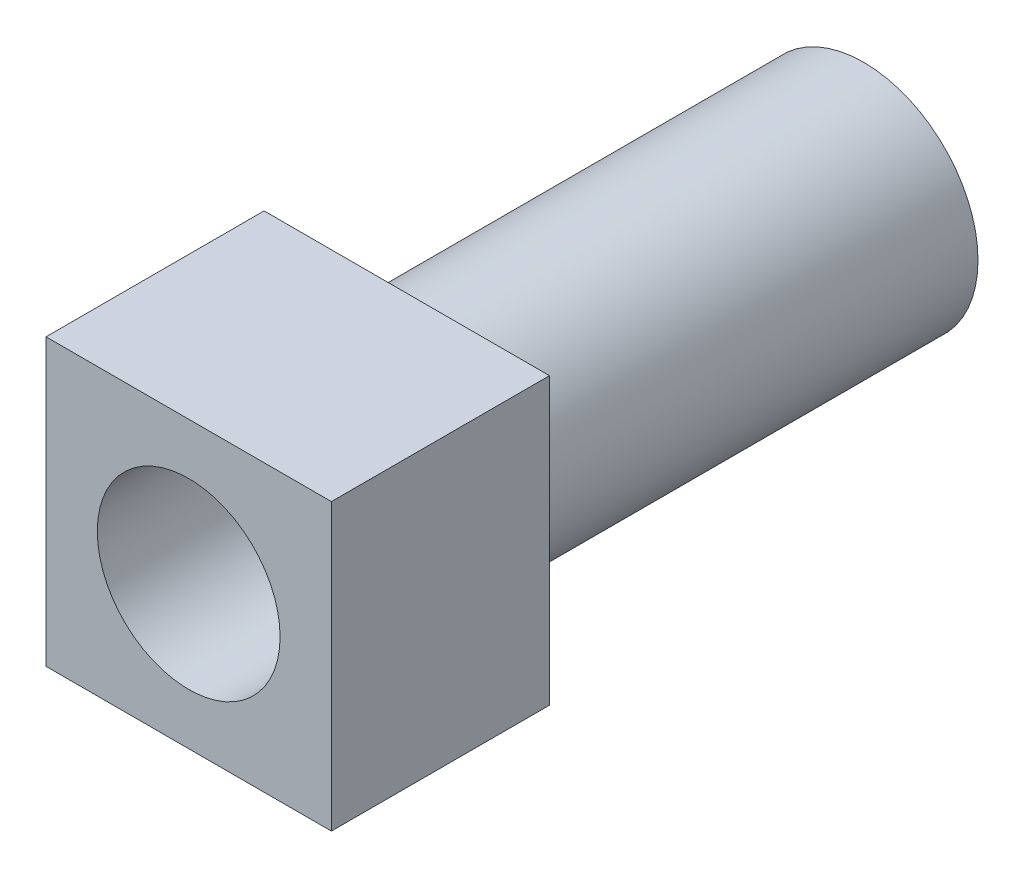
ISO-10303-21;
HEADER;
FILE_DESCRIPTION(('STEP AP214'),'2;1');
FILE_NAME('part.step','',(''),(''),'','','');
FILE_SCHEMA(('AUTOMOTIVE_DESIGN { 1 0 10303 214 1 1 1 1 }'));
ENDSEC;
DATA;
#1=APPLICATION_CONTEXT('core data for automotive mechanical design processes');
#2=APPLICATION_PROTOCOL_DEFINITION('international standard','automotive_design',2000,#1);
#3=PRODUCT_CONTEXT('',#1,'mechanical');
#4=PRODUCT('Part','Part','',(#3));
#5=PRODUCT_RELATED_PRODUCT_CATEGORY('part','',(#4));
#6=PRODUCT_DEFINITION_FORMATION('','',#4);
#7=PRODUCT_DEFINITION_CONTEXT('part definition',#1,'design');
#8=PRODUCT_DEFINITION('design','',#6,#7);
#9=PRODUCT_DEFINITION_SHAPE('','',#8);
#10=(LENGTH_UNIT() NAMED_UNIT(*) SI_UNIT(.MILLI.,.METRE.));
#11=(NAMED_UNIT(*) PLANE_ANGLE_UNIT() SI_UNIT($,.RADIAN.));
#12=(NAMED_UNIT(*) SI_UNIT($,.STERADIAN.) SOLID_ANGLE_UNIT());
#13=UNCERTAINTY_MEASURE_WITH_UNIT(LENGTH_MEASURE(1.E-05),#10,'distance_accuracy_value','');
#14=(GEOMETRIC_REPRESENTATION_CONTEXT(3) GLOBAL_UNCERTAINTY_ASSIGNED_CONTEXT((#13)) GLOBAL_UNIT_ASSIGNED_CONTEXT((#10,
#11,#12)) REPRESENTATION_CONTEXT('',''));
#15=CARTESIAN_POINT('',(0.,0.,0.));
#16=DIRECTION('',(0.,0.,1.));
#17=DIRECTION('',(1.,0.,0.));
#18=AXIS2_PLACEMENT_3D('',#15,#16,#17);
#19=CARTESIAN_POINT('',(-37.0560711306256,15.4804,10.5));
#20=DIRECTION('',(1.,0.,0.));
#21=DIRECTION('',(0.,0.,-1.));
#22=AXIS2_PLACEMENT_3D('',#19,#20,#21);
#23=PLANE('',#22);
#24=DIRECTION('',(0.,-1.,0.));
#25=VECTOR('',#24,1.);
#26=CARTESIAN_POINT('',(-37.0560711306256,15.4804,0.));
#27=LINE('',#26,#25);
#28=CARTESIAN_POINT('',(-37.0560711306256,15.4804,0.));
#29=VERTEX_POINT('',#28);
#30=CARTESIAN_POINT('',(-37.0560711306256,1.74039999999999,0.));
#31=VERTEX_POINT('',#30);
#32=EDGE_CURVE('E110',#29,#31,#27,.T.);
#33=ORIENTED_EDGE('',*,*,#32,.T.);
#34=DIRECTION('',(0.,0.,-1.));
#35=VECTOR('',#34,1.);
#36=CARTESIAN_POINT('',(-37.0560711306256,1.74039999999999,10.5));
#37=LINE('',#36,#35);
#38=CARTESIAN_POINT('',(-37.0560711306256,1.74039999999999,10.5));
#39=VERTEX_POINT('',#38);
#40=EDGE_CURVE('E42',#39,#31,#37,.T.);
#41=ORIENTED_EDGE('',*,*,#40,.F.);
#42=DIRECTION('',(0.,-1.,0.));
#43=VECTOR('',#42,1.);
#44=CARTESIAN_POINT('',(-37.0560711306256,15.4804,10.5));
#45=LINE('',#44,#43);
#46=CARTESIAN_POINT('',(-37.0560711306256,15.4804,10.5));
#47=VERTEX_POINT('',#46);
#48=EDGE_CURVE('E113',#47,#39,#45,.T.);
#49=ORIENTED_EDGE('',*,*,#48,.F.);
#50=DIRECTION('',(0.,0.,-1.));
#51=VECTOR('',#50,1.);
#52=CARTESIAN_POINT('',(-37.0560711306256,15.4804,10.5));
#53=LINE('',#52,#51);
#54=EDGE_CURVE('E123',#47,#29,#53,.T.);
#55=ORIENTED_EDGE('',*,*,#54,.T.);
#56=EDGE_LOOP('',(#33,#41,#49,#55));
#57=FACE_BOUND('',#56,.T.);
#58=ADVANCED_FACE('F35',(#57),#23,.F.);
#59=CARTESIAN_POINT('',(-37.0560711306256,1.74039999999999,10.5));
#60=DIRECTION('',(0.,1.,0.));
#61=DIRECTION('',(0.,0.,1.));
#62=AXIS2_PLACEMENT_3D('',#59,#60,#61);
#63=PLANE('',#62);
#64=DIRECTION('',(1.,0.,0.));
#65=VECTOR('',#64,1.);
#66=CARTESIAN_POINT('',(-37.0560711306256,1.74039999999999,0.));
#67=LINE('',#66,#65);
#68=CARTESIAN_POINT('',(-23.3160711306256,1.74039999999999,0.));
#69=VERTEX_POINT('',#68);
#70=EDGE_CURVE('E126',#31,#69,#67,.T.);
#71=ORIENTED_EDGE('',*,*,#70,.T.);
#72=DIRECTION('',(0.,0.,-1.));
#73=VECTOR('',#72,1.);
#74=CARTESIAN_POINT('',(-23.3160711306256,1.74039999999999,10.5));
#75=LINE('',#74,#73);
#76=CARTESIAN_POINT('',(-23.3160711306256,1.74039999999999,10.5));
#77=VERTEX_POINT('',#76);
#78=EDGE_CURVE('E136',#77,#69,#75,.T.);
#79=ORIENTED_EDGE('',*,*,#78,.F.);
#80=DIRECTION('',(1.,0.,0.));
#81=VECTOR('',#80,1.);
#82=CARTESIAN_POINT('',(-37.0560711306256,1.74039999999999,10.5));
#83=LINE('',#82,#81);
#84=EDGE_CURVE('E116',#39,#77,#83,.T.);
#85=ORIENTED_EDGE('',*,*,#84,.F.);
#86=ORIENTED_EDGE('',*,*,#40,.T.);
#87=EDGE_LOOP('',(#71,#79,#85,#86));
#88=FACE_BOUND('',#87,.T.);
#89=ADVANCED_FACE('F141',(#88),#63,.F.);
#90=CARTESIAN_POINT('',(-23.3160711306256,15.4804,10.5));
#91=DIRECTION('',(-1.,0.,0.));
#92=DIRECTION('',(0.,-1.,0.));
#93=AXIS2_PLACEMENT_3D('',#90,#91,#92);
#94=PLANE('',#93);
#95=DIRECTION('',(0.,1.,0.));
#96=VECTOR('',#95,1.);
#97=CARTESIAN_POINT('',(-23.3160711306256,15.4804,0.));
#98=LINE('',#97,#96);
#99=CARTESIAN_POINT('',(-23.3160711306256,15.4804,0.));
#100=VERTEX_POINT('',#99);
#101=EDGE_CURVE('E128',#69,#100,#98,.T.);
#102=ORIENTED_EDGE('',*,*,#101,.T.);
#103=DIRECTION('',(0.,0.,-1.));
#104=VECTOR('',#103,1.);
#105=CARTESIAN_POINT('',(-23.3160711306256,15.4804,10.5));
#106=LINE('',#105,#104);
#107=CARTESIAN_POINT('',(-23.3160711306256,15.4804,10.5));
#108=VERTEX_POINT('',#107);
#109=EDGE_CURVE('E133',#108,#100,#106,.T.);
#110=ORIENTED_EDGE('',*,*,#109,.F.);
#111=DIRECTION('',(0.,1.,0.));
#112=VECTOR('',#111,1.);
#113=CARTESIAN_POINT('',(-23.3160711306256,15.4804,10.5));
#114=LINE('',#113,#112);
#115=EDGE_CURVE('E119',#77,#108,#114,.T.);
#116=ORIENTED_EDGE('',*,*,#115,.F.);
#117=ORIENTED_EDGE('',*,*,#78,.T.);
#118=EDGE_LOOP('',(#102,#110,#116,#117));
#119=FACE_BOUND('',#118,.T.);
#120=ADVANCED_FACE('F153',(#119),#94,.F.);
#121=CARTESIAN_POINT('',(-37.0560711306256,15.4804,10.5));
#122=DIRECTION('',(0.,-1.,0.));
#123=DIRECTION('',(0.,0.,-1.));
#124=AXIS2_PLACEMENT_3D('',#121,#122,#123);
#125=PLANE('',#124);
#126=DIRECTION('',(-1.,0.,0.));
#127=VECTOR('',#126,1.);
#128=CARTESIAN_POINT('',(-37.0560711306256,15.4804,0.));
#129=LINE('',#128,#127);
#130=EDGE_CURVE('E117',#100,#29,#129,.T.);
#131=ORIENTED_EDGE('',*,*,#130,.T.);
#132=ORIENTED_EDGE('',*,*,#54,.F.);
#133=DIRECTION('',(-1.,0.,0.));
#134=VECTOR('',#133,1.);
#135=CARTESIAN_POINT('',(-37.0560711306256,15.4804,10.5));
#136=LINE('',#135,#134);
#137=EDGE_CURVE('E121',#108,#47,#136,.T.);
#138=ORIENTED_EDGE('',*,*,#137,.F.);
#139=ORIENTED_EDGE('',*,*,#109,.T.);
#140=EDGE_LOOP('',(#131,#132,#138,#139));
#141=FACE_BOUND('',#140,.T.);
#142=ADVANCED_FACE('F157',(#141),#125,.F.);
#143=CARTESIAN_POINT('',(0.,0.,10.5));
#144=DIRECTION('',(0.,0.,1.));
#145=DIRECTION('',(1.,0.,0.));
#146=AXIS2_PLACEMENT_3D('',#143,#144,#145);
#147=PLANE('',#146);
#148=CARTESIAN_POINT('',(-30.1860711306256,8.61039999999999,10.5));
#149=DIRECTION('',(0.,0.,1.));
#150=DIRECTION('',(1.,0.,0.));
#151=AXIS2_PLACEMENT_3D('',#148,#149,#150);
#152=CIRCLE('',#151,4.4);
#153=CARTESIAN_POINT('',(-25.7860711306256,8.61039999999999,10.5));
#154=VERTEX_POINT('',#153);
#155=EDGE_CURVE('E106',#154,#154,#152,.T.);
#156=ORIENTED_EDGE('',*,*,#155,.F.);
#157=EDGE_LOOP('',(#156));
#158=FACE_BOUND('',#157,.T.);
#159=ORIENTED_EDGE('',*,*,#48,.T.);
#160=ORIENTED_EDGE('',*,*,#84,.T.);
#161=ORIENTED_EDGE('',*,*,#115,.T.);
#162=ORIENTED_EDGE('',*,*,#137,.T.);
#163=EDGE_LOOP('',(#159,#160,#161,#162));
#164=FACE_BOUND('',#163,.T.);
#165=ADVANCED_FACE('F159',(#158,#164),#147,.T.);
#166=CARTESIAN_POINT('',(0.,0.,0.));
#167=DIRECTION('',(0.,0.,1.));
#168=DIRECTION('',(1.,0.,0.));
#169=AXIS2_PLACEMENT_3D('',#166,#167,#168);
#170=PLANE('',#169);
#171=CARTESIAN_POINT('',(-30.1860711306256,8.61039999999999,0.));
#172=DIRECTION('',(0.,0.,1.));
#173=DIRECTION('',(1.,0.,0.));
#174=AXIS2_PLACEMENT_3D('',#171,#172,#173);
#175=CIRCLE('',#174,5.5);
#176=CARTESIAN_POINT('',(-24.6860711306256,8.61039999999999,0.));
#177=VERTEX_POINT('',#176);
#178=EDGE_CURVE('E11',#177,#177,#175,.F.);
#179=ORIENTED_EDGE('',*,*,#178,.F.);
#180=EDGE_LOOP('',(#179));
#181=FACE_BOUND('',#180,.T.);
#182=ORIENTED_EDGE('',*,*,#32,.F.);
#183=ORIENTED_EDGE('',*,*,#130,.F.);
#184=ORIENTED_EDGE('',*,*,#101,.F.);
#185=ORIENTED_EDGE('',*,*,#70,.F.);
#186=EDGE_LOOP('',(#182,#183,#184,#185));
#187=FACE_BOUND('',#186,.T.);
#188=ADVANCED_FACE('F149',(#181,#187),#170,.F.);
#189=CARTESIAN_POINT('',(-30.1860711306256,8.61039999999999,0.5));
#190=DIRECTION('',(0.,0.,1.));
#191=DIRECTION('',(1.,0.,0.));
#192=AXIS2_PLACEMENT_3D('',#189,#190,#191);
#193=CYLINDRICAL_SURFACE('',#192,4.4);
#194=CARTESIAN_POINT('',(-30.1860711306256,8.61039999999999,0.5));
#195=DIRECTION('',(0.,0.,1.));
#196=DIRECTION('',(1.,0.,0.));
#197=AXIS2_PLACEMENT_3D('',#194,#195,#196);
#198=CIRCLE('',#197,4.4);
#199=CARTESIAN_POINT('',(-25.7860711306256,8.61039999999999,0.5));
#200=VERTEX_POINT('',#199);
#201=EDGE_CURVE('E107',#200,#200,#198,.T.);
#202=ORIENTED_EDGE('',*,*,#201,.F.);
#203=EDGE_LOOP('',(#202));
#204=FACE_BOUND('',#203,.T.);
#205=ORIENTED_EDGE('',*,*,#155,.T.);
#206=EDGE_LOOP('',(#205));
#207=FACE_BOUND('',#206,.T.);
#208=ADVANCED_FACE('F167',(#204,#207),#193,.F.);
#209=CARTESIAN_POINT('',(-30.1860711306256,8.61039999999999,0.5));
#210=DIRECTION('',(0.,0.,1.));
#211=DIRECTION('',(1.,0.,0.));
#212=AXIS2_PLACEMENT_3D('',#209,#210,#211);
#213=PLANE('',#212);
#214=ORIENTED_EDGE('',*,*,#201,.T.);
#215=EDGE_LOOP('',(#214));
#216=FACE_BOUND('',#215,.T.);
#217=ADVANCED_FACE('F201',(#216),#213,.T.);
#218=CARTESIAN_POINT('',(-30.1860711306256,8.61039999999999,-22.));
#219=DIRECTION('',(0.,0.,1.));
#220=DIRECTION('',(1.,0.,0.));
#221=AXIS2_PLACEMENT_3D('',#218,#219,#220);
#222=CYLINDRICAL_SURFACE('',#221,5.5);
#223=CARTESIAN_POINT('',(-30.1860711306256,8.61039999999999,-22.));
#224=DIRECTION('',(0.,0.,-1.));
#225=DIRECTION('',(-1.,0.,0.));
#226=AXIS2_PLACEMENT_3D('',#223,#224,#225);
#227=CIRCLE('',#226,5.5);
#228=CARTESIAN_POINT('',(-35.6860711306256,8.61039999999999,-22.));
#229=VERTEX_POINT('',#228);
#230=EDGE_CURVE('E102',#229,#229,#227,.T.);
#231=ORIENTED_EDGE('',*,*,#230,.F.);
#232=EDGE_LOOP('',(#231));
#233=FACE_BOUND('',#232,.T.);
#234=ORIENTED_EDGE('',*,*,#178,.T.);
#235=EDGE_LOOP('',(#234));
#236=FACE_BOUND('',#235,.T.);
#237=ADVANCED_FACE('F210',(#233,#236),#222,.T.);
#238=CARTESIAN_POINT('',(-30.1860711306256,8.61039999999999,-22.));
#239=DIRECTION('',(0.,0.,-1.));
#240=DIRECTION('',(-1.,0.,0.));
#241=AXIS2_PLACEMENT_3D('',#238,#239,#240);
#242=PLANE('',#241);
#243=CARTESIAN_POINT('',(-30.1860711306256,8.61039999999999,-22.));
#244=DIRECTION('',(0.,0.,-1.));
#245=DIRECTION('',(-1.,0.,0.));
#246=AXIS2_PLACEMENT_3D('',#243,#244,#245);
#247=CIRCLE('',#246,2.8);
#248=CARTESIAN_POINT('',(-28.881418946301,11.0878750610121,-22.));
#249=VERTEX_POINT('',#248);
#250=CARTESIAN_POINT('',(-32.5589266442012,10.096857773263,-22.));
#251=VERTEX_POINT('',#250);
#252=EDGE_CURVE('E53',#249,#251,#247,.T.);
#253=ORIENTED_EDGE('',*,*,#252,.F.);
#254=DIRECTION('',(-0.965555156194782,-0.260198463380687,0.));
#255=VECTOR('',#254,1.);
#256=CARTESIAN_POINT('',(-32.5589266442012,10.096857773263,-22.));
#257=LINE('',#256,#255);
#258=EDGE_CURVE('E97',#249,#251,#257,.T.);
#259=ORIENTED_EDGE('',*,*,#258,.T.);
#260=EDGE_LOOP('',(#253,#259));
#261=FACE_BOUND('',#260,.T.);
#262=ORIENTED_EDGE('',*,*,#230,.T.);
#263=EDGE_LOOP('',(#262));
#264=FACE_BOUND('',#263,.T.);
#265=ADVANCED_FACE('F225',(#261,#264),#242,.T.);
#266=CARTESIAN_POINT('',(-30.1860711306256,8.61039999999999,-22.));
#267=DIRECTION('',(0.,0.,1.));
#268=DIRECTION('',(1.,0.,0.));
#269=AXIS2_PLACEMENT_3D('',#266,#267,#268);
#270=CYLINDRICAL_SURFACE('',#269,2.8);
#271=DIRECTION('',(0.,0.,-1.));
#272=VECTOR('',#271,1.);
#273=CARTESIAN_POINT('',(-28.8814189463009,11.0878750610121,0.));
#274=LINE('',#273,#272);
#275=CARTESIAN_POINT('',(-28.8814189463009,11.0878750610121,0.));
#276=VERTEX_POINT('',#275);
#277=EDGE_CURVE('E49',#276,#249,#274,.T.);
#278=ORIENTED_EDGE('',*,*,#277,.T.);
#279=ORIENTED_EDGE('',*,*,#252,.T.);
#280=DIRECTION('',(0.,0.,-1.));
#281=VECTOR('',#280,1.);
#282=CARTESIAN_POINT('',(-32.5589266442012,10.096857773263,0.));
#283=LINE('',#282,#281);
#284=CARTESIAN_POINT('',(-32.5589266442012,10.096857773263,0.));
#285=VERTEX_POINT('',#284);
#286=EDGE_CURVE('E89',#285,#251,#283,.T.);
#287=ORIENTED_EDGE('',*,*,#286,.F.);
#288=CARTESIAN_POINT('',(-30.1860711306256,8.61039999999999,0.));
#289=DIRECTION('',(0.,0.,-1.));
#290=DIRECTION('',(-1.,0.,0.));
#291=AXIS2_PLACEMENT_3D('',#288,#289,#290);
#292=CIRCLE('',#291,2.8);
#293=EDGE_CURVE('E85',#276,#285,#292,.T.);
#294=ORIENTED_EDGE('',*,*,#293,.F.);
#295=EDGE_LOOP('',(#278,#279,#287,#294));
#296=FACE_BOUND('',#295,.T.);
#297=ADVANCED_FACE('F91',(#296),#270,.F.);
#298=CARTESIAN_POINT('',(-30.1860711306256,8.61039999999999,0.));
#299=DIRECTION('',(0.,0.,-1.));
#300=DIRECTION('',(-1.,0.,0.));
#301=AXIS2_PLACEMENT_3D('',#298,#299,#300);
#302=PLANE('',#301);
#303=DIRECTION('',(-0.965555156194782,-0.260198463380687,0.));
#304=VECTOR('',#303,1.);
#305=CARTESIAN_POINT('',(-32.5589266442012,10.096857773263,0.));
#306=LINE('',#305,#304);
#307=EDGE_CURVE('E88',#276,#285,#306,.T.);
#308=ORIENTED_EDGE('',*,*,#307,.F.);
#309=ORIENTED_EDGE('',*,*,#293,.T.);
#310=EDGE_LOOP('',(#308,#309));
#311=FACE_BOUND('',#310,.T.);
#312=ADVANCED_FACE('F86',(#311),#302,.T.);
#313=CARTESIAN_POINT('',(-32.5589266442012,10.096857773263,0.));
#314=DIRECTION('',(0.260198463380687,-0.965555156194782,0.));
#315=DIRECTION('',(0.965555156194782,0.260198463380687,0.));
#316=AXIS2_PLACEMENT_3D('',#313,#314,#315);
#317=PLANE('',#316);
#318=ORIENTED_EDGE('',*,*,#258,.F.);
#319=ORIENTED_EDGE('',*,*,#277,.F.);
#320=ORIENTED_EDGE('',*,*,#307,.T.);
#321=ORIENTED_EDGE('',*,*,#286,.T.);
#322=EDGE_LOOP('',(#318,#319,#320,#321));
#323=FACE_BOUND('',#322,.T.);
#324=ADVANCED_FACE('F96',(#323),#317,.T.);
#325=CLOSED_SHELL('',(#58,#89,#120,#142,#165,#188,#208,#217,#237,#265,#297,#312,#324));
#326=MANIFOLD_SOLID_BREP('B2',#325);
#327=ADVANCED_BREP_SHAPE_REPRESENTATION('',(#18,#326),#14);
#328=SHAPE_DEFINITION_REPRESENTATION(#9,#327);
ENDSEC;
END-ISO-10303-21;
